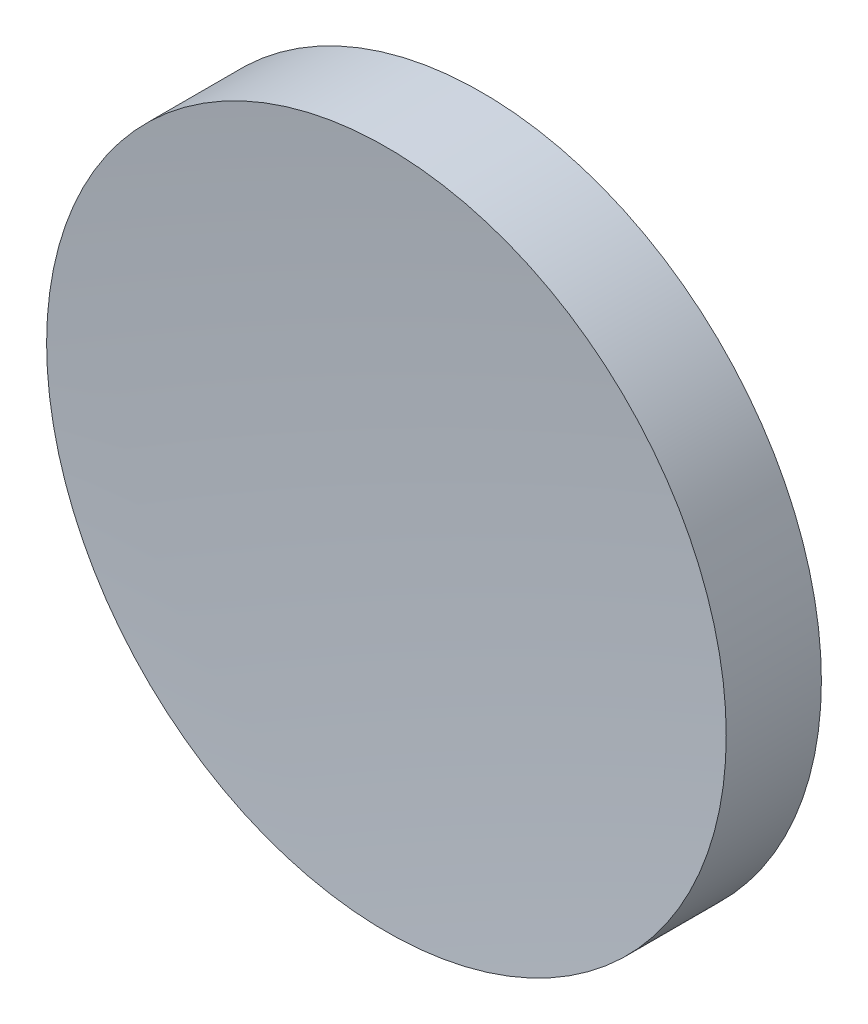
ISO-10303-21;
HEADER;
FILE_DESCRIPTION(('STEP AP214'),'2;1');
FILE_NAME('part.step','',(''),(''),'','','');
FILE_SCHEMA(('AUTOMOTIVE_DESIGN { 1 0 10303 214 1 1 1 1 }'));
ENDSEC;
DATA;
#1=APPLICATION_CONTEXT('core data for automotive mechanical design processes');
#2=APPLICATION_PROTOCOL_DEFINITION('international standard','automotive_design',2000,#1);
#3=PRODUCT_CONTEXT('',#1,'mechanical');
#4=PRODUCT('Part','Part','',(#3));
#5=PRODUCT_RELATED_PRODUCT_CATEGORY('part','',(#4));
#6=PRODUCT_DEFINITION_FORMATION('','',#4);
#7=PRODUCT_DEFINITION_CONTEXT('part definition',#1,'design');
#8=PRODUCT_DEFINITION('design','',#6,#7);
#9=PRODUCT_DEFINITION_SHAPE('','',#8);
#10=(LENGTH_UNIT() NAMED_UNIT(*) SI_UNIT(.MILLI.,.METRE.));
#11=(NAMED_UNIT(*) PLANE_ANGLE_UNIT() SI_UNIT($,.RADIAN.));
#12=(NAMED_UNIT(*) SI_UNIT($,.STERADIAN.) SOLID_ANGLE_UNIT());
#13=UNCERTAINTY_MEASURE_WITH_UNIT(LENGTH_MEASURE(1.E-05),#10,'distance_accuracy_value','');
#14=(GEOMETRIC_REPRESENTATION_CONTEXT(3) GLOBAL_UNCERTAINTY_ASSIGNED_CONTEXT((#13)) GLOBAL_UNIT_ASSIGNED_CONTEXT((#10,
#11,#12)) REPRESENTATION_CONTEXT('',''));
#15=CARTESIAN_POINT('',(0.,0.,0.));
#16=DIRECTION('',(0.,0.,1.));
#17=DIRECTION('',(1.,0.,0.));
#18=AXIS2_PLACEMENT_3D('',#15,#16,#17);
#19=CARTESIAN_POINT('',(0.,0.,35.));
#20=DIRECTION('',(0.,0.,-1.));
#21=DIRECTION('',(-1.,0.,0.));
#22=AXIS2_PLACEMENT_3D('',#19,#20,#21);
#23=CYLINDRICAL_SURFACE('',#22,125.);
#24=CARTESIAN_POINT('',(1.94289029309402E-13,0.,34.9999999999999));
#25=DIRECTION('',(0.,0.,1.));
#26=DIRECTION('',(1.,0.,0.));
#27=AXIS2_PLACEMENT_3D('',#24,#25,#26);
#28=CIRCLE('',#27,125.);
#29=CARTESIAN_POINT('',(125.,0.,34.9999999999999));
#30=VERTEX_POINT('',#29);
#31=EDGE_CURVE('E39',#30,#30,#28,.F.);
#32=ORIENTED_EDGE('',*,*,#31,.T.);
#33=EDGE_LOOP('',(#32));
#34=FACE_BOUND('',#33,.T.);
#35=CARTESIAN_POINT('',(0.,0.,0.));
#36=DIRECTION('',(0.,0.,1.));
#37=DIRECTION('',(1.,0.,0.));
#38=AXIS2_PLACEMENT_3D('',#35,#36,#37);
#39=CIRCLE('',#38,125.);
#40=CARTESIAN_POINT('',(125.,0.,0.));
#41=VERTEX_POINT('',#40);
#42=EDGE_CURVE('E10',#41,#41,#39,.T.);
#43=ORIENTED_EDGE('',*,*,#42,.T.);
#44=EDGE_LOOP('',(#43));
#45=FACE_BOUND('',#44,.T.);
#46=ADVANCED_FACE('F33',(#34,#45),#23,.T.);
#47=CARTESIAN_POINT('',(0.,0.,0.));
#48=DIRECTION('',(0.,0.,1.));
#49=DIRECTION('',(1.,0.,0.));
#50=AXIS2_PLACEMENT_3D('',#47,#48,#49);
#51=PLANE('',#50);
#52=ORIENTED_EDGE('',*,*,#42,.F.);
#53=EDGE_LOOP('',(#52));
#54=FACE_BOUND('',#53,.T.);
#55=ADVANCED_FACE('F48',(#54),#51,.F.);
#56=CARTESIAN_POINT('',(1.94289029309402E-13,0.,1630.10971409493));
#57=DIRECTION('',(0.,0.,-1.));
#58=DIRECTION('',(1.,0.,0.));
#59=AXIS2_PLACEMENT_3D('',#56,#57,#58);
#60=SPHERICAL_SURFACE('',#59,1600.);
#61=ORIENTED_EDGE('',*,*,#31,.F.);
#62=EDGE_LOOP('',(#61));
#63=FACE_BOUND('',#62,.T.);
#64=ADVANCED_FACE('F46',(#63),#60,.F.);
#65=CLOSED_SHELL('',(#46,#55,#64));
#66=MANIFOLD_SOLID_BREP('B2',#65);
#67=ADVANCED_BREP_SHAPE_REPRESENTATION('',(#18,#66),#14);
#68=SHAPE_DEFINITION_REPRESENTATION(#9,#67);
ENDSEC;
END-ISO-10303-21;
